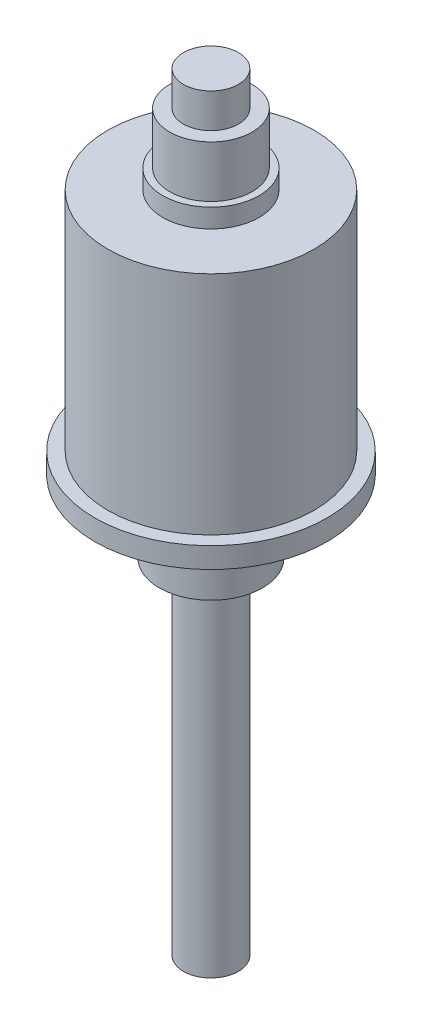
ISO-10303-21;
HEADER;
FILE_DESCRIPTION(('STEP AP214'),'2;1');
FILE_NAME('part.step','',(''),(''),'','','');
FILE_SCHEMA(('AUTOMOTIVE_DESIGN { 1 0 10303 214 1 1 1 1 }'));
ENDSEC;
DATA;
#1=APPLICATION_CONTEXT('core data for automotive mechanical design processes');
#2=APPLICATION_PROTOCOL_DEFINITION('international standard','automotive_design',2000,#1);
#3=PRODUCT_CONTEXT('',#1,'mechanical');
#4=PRODUCT('Part','Part','',(#3));
#5=PRODUCT_RELATED_PRODUCT_CATEGORY('part','',(#4));
#6=PRODUCT_DEFINITION_FORMATION('','',#4);
#7=PRODUCT_DEFINITION_CONTEXT('part definition',#1,'design');
#8=PRODUCT_DEFINITION('design','',#6,#7);
#9=PRODUCT_DEFINITION_SHAPE('','',#8);
#10=(LENGTH_UNIT() NAMED_UNIT(*) SI_UNIT(.MILLI.,.METRE.));
#11=(NAMED_UNIT(*) PLANE_ANGLE_UNIT() SI_UNIT($,.RADIAN.));
#12=(NAMED_UNIT(*) SI_UNIT($,.STERADIAN.) SOLID_ANGLE_UNIT());
#13=UNCERTAINTY_MEASURE_WITH_UNIT(LENGTH_MEASURE(1.E-05),#10,'distance_accuracy_value','');
#14=(GEOMETRIC_REPRESENTATION_CONTEXT(3) GLOBAL_UNCERTAINTY_ASSIGNED_CONTEXT((#13)) GLOBAL_UNIT_ASSIGNED_CONTEXT((#10,
#11,#12)) REPRESENTATION_CONTEXT('',''));
#15=CARTESIAN_POINT('',(0.,0.,0.));
#16=DIRECTION('',(0.,0.,1.));
#17=DIRECTION('',(1.,0.,0.));
#18=AXIS2_PLACEMENT_3D('',#15,#16,#17);
#19=CARTESIAN_POINT('',(0.,0.,0.));
#20=DIRECTION('',(0.,1.,0.));
#21=DIRECTION('',(0.,0.,1.));
#22=AXIS2_PLACEMENT_3D('',#19,#20,#21);
#23=PLANE('',#22);
#24=CARTESIAN_POINT('',(0.,0.,0.));
#25=DIRECTION('',(0.,1.,0.));
#26=DIRECTION('',(0.,0.,1.));
#27=AXIS2_PLACEMENT_3D('',#24,#25,#26);
#28=CIRCLE('',#27,4.);
#29=CARTESIAN_POINT('',(0.,0.,4.));
#30=VERTEX_POINT('',#29);
#31=EDGE_CURVE('E10',#30,#30,#28,.T.);
#32=ORIENTED_EDGE('',*,*,#31,.T.);
#33=EDGE_LOOP('',(#32));
#34=FACE_BOUND('',#33,.T.);
#35=ADVANCED_FACE('F37',(#34),#23,.T.);
#36=CARTESIAN_POINT('',(0.,40.0334496894889,0.));
#37=DIRECTION('',(0.,1.,0.));
#38=DIRECTION('',(0.,0.,1.));
#39=AXIS2_PLACEMENT_3D('',#36,#37,#38);
#40=CYLINDRICAL_SURFACE('',#39,4.);
#41=CARTESIAN_POINT('',(0.,-5.,0.));
#42=DIRECTION('',(0.,1.,0.));
#43=DIRECTION('',(0.,0.,1.));
#44=AXIS2_PLACEMENT_3D('',#41,#42,#43);
#45=CIRCLE('',#44,4.);
#46=CARTESIAN_POINT('',(0.,-5.,4.));
#47=VERTEX_POINT('',#46);
#48=EDGE_CURVE('E43',#47,#47,#45,.T.);
#49=ORIENTED_EDGE('',*,*,#48,.T.);
#50=EDGE_LOOP('',(#49));
#51=FACE_BOUND('',#50,.T.);
#52=ORIENTED_EDGE('',*,*,#31,.F.);
#53=EDGE_LOOP('',(#52));
#54=FACE_BOUND('',#53,.T.);
#55=ADVANCED_FACE('F105',(#51,#54),#40,.T.);
#56=CARTESIAN_POINT('',(-4.,-5.,0.));
#57=DIRECTION('',(0.,1.,0.));
#58=DIRECTION('',(0.,0.,1.));
#59=AXIS2_PLACEMENT_3D('',#56,#57,#58);
#60=PLANE('',#59);
#61=CARTESIAN_POINT('',(0.,-5.,0.));
#62=DIRECTION('',(0.,1.,0.));
#63=DIRECTION('',(0.,0.,1.));
#64=AXIS2_PLACEMENT_3D('',#61,#62,#63);
#65=CIRCLE('',#64,6.);
#66=CARTESIAN_POINT('',(0.,-5.,6.));
#67=VERTEX_POINT('',#66);
#68=EDGE_CURVE('E47',#67,#67,#65,.T.);
#69=ORIENTED_EDGE('',*,*,#68,.T.);
#70=EDGE_LOOP('',(#69));
#71=FACE_BOUND('',#70,.T.);
#72=ORIENTED_EDGE('',*,*,#48,.F.);
#73=EDGE_LOOP('',(#72));
#74=FACE_BOUND('',#73,.T.);
#75=ADVANCED_FACE('F109',(#71,#74),#60,.T.);
#76=CARTESIAN_POINT('',(0.,40.0334496894889,0.));
#77=DIRECTION('',(0.,1.,0.));
#78=DIRECTION('',(0.,0.,1.));
#79=AXIS2_PLACEMENT_3D('',#76,#77,#78);
#80=CYLINDRICAL_SURFACE('',#79,6.);
#81=CARTESIAN_POINT('',(0.,-12.5,0.));
#82=DIRECTION('',(0.,1.,0.));
#83=DIRECTION('',(0.,0.,1.));
#84=AXIS2_PLACEMENT_3D('',#81,#82,#83);
#85=CIRCLE('',#84,6.);
#86=CARTESIAN_POINT('',(0.,-12.5,6.));
#87=VERTEX_POINT('',#86);
#88=EDGE_CURVE('E51',#87,#87,#85,.T.);
#89=ORIENTED_EDGE('',*,*,#88,.T.);
#90=EDGE_LOOP('',(#89));
#91=FACE_BOUND('',#90,.T.);
#92=ORIENTED_EDGE('',*,*,#68,.F.);
#93=EDGE_LOOP('',(#92));
#94=FACE_BOUND('',#93,.T.);
#95=ADVANCED_FACE('F113',(#91,#94),#80,.T.);
#96=CARTESIAN_POINT('',(-6.,-12.5,0.));
#97=DIRECTION('',(0.,1.,0.));
#98=DIRECTION('',(0.,0.,1.));
#99=AXIS2_PLACEMENT_3D('',#96,#97,#98);
#100=PLANE('',#99);
#101=CARTESIAN_POINT('',(0.,-12.5,0.));
#102=DIRECTION('',(0.,1.,0.));
#103=DIRECTION('',(0.,0.,1.));
#104=AXIS2_PLACEMENT_3D('',#101,#102,#103);
#105=CIRCLE('',#104,7.);
#106=CARTESIAN_POINT('',(0.,-12.5,7.));
#107=VERTEX_POINT('',#106);
#108=EDGE_CURVE('E56',#107,#107,#105,.T.);
#109=ORIENTED_EDGE('',*,*,#108,.T.);
#110=EDGE_LOOP('',(#109));
#111=FACE_BOUND('',#110,.T.);
#112=ORIENTED_EDGE('',*,*,#88,.F.);
#113=EDGE_LOOP('',(#112));
#114=FACE_BOUND('',#113,.T.);
#115=ADVANCED_FACE('F120',(#111,#114),#100,.T.);
#116=CARTESIAN_POINT('',(0.,40.0334496894889,0.));
#117=DIRECTION('',(0.,1.,0.));
#118=DIRECTION('',(0.,0.,1.));
#119=AXIS2_PLACEMENT_3D('',#116,#117,#118);
#120=CYLINDRICAL_SURFACE('',#119,7.);
#121=CARTESIAN_POINT('',(0.,-15.25,0.));
#122=DIRECTION('',(0.,1.,0.));
#123=DIRECTION('',(0.,0.,1.));
#124=AXIS2_PLACEMENT_3D('',#121,#122,#123);
#125=CIRCLE('',#124,7.);
#126=CARTESIAN_POINT('',(0.,-15.25,7.));
#127=VERTEX_POINT('',#126);
#128=EDGE_CURVE('E59',#127,#127,#125,.T.);
#129=ORIENTED_EDGE('',*,*,#128,.T.);
#130=EDGE_LOOP('',(#129));
#131=FACE_BOUND('',#130,.T.);
#132=ORIENTED_EDGE('',*,*,#108,.F.);
#133=EDGE_LOOP('',(#132));
#134=FACE_BOUND('',#133,.T.);
#135=ADVANCED_FACE('F124',(#131,#134),#120,.T.);
#136=CARTESIAN_POINT('',(-7.,-15.25,0.));
#137=DIRECTION('',(0.,1.,0.));
#138=DIRECTION('',(0.,0.,1.));
#139=AXIS2_PLACEMENT_3D('',#136,#137,#138);
#140=PLANE('',#139);
#141=CARTESIAN_POINT('',(0.,-15.25,0.));
#142=DIRECTION('',(0.,1.,0.));
#143=DIRECTION('',(0.,0.,1.));
#144=AXIS2_PLACEMENT_3D('',#141,#142,#143);
#145=CIRCLE('',#144,14.9815);
#146=CARTESIAN_POINT('',(0.,-15.25,14.9815));
#147=VERTEX_POINT('',#146);
#148=EDGE_CURVE('E62',#147,#147,#145,.T.);
#149=ORIENTED_EDGE('',*,*,#148,.T.);
#150=EDGE_LOOP('',(#149));
#151=FACE_BOUND('',#150,.T.);
#152=ORIENTED_EDGE('',*,*,#128,.F.);
#153=EDGE_LOOP('',(#152));
#154=FACE_BOUND('',#153,.T.);
#155=ADVANCED_FACE('F128',(#151,#154),#140,.T.);
#156=CARTESIAN_POINT('',(0.,40.0334496894889,0.));
#157=DIRECTION('',(0.,1.,0.));
#158=DIRECTION('',(0.,0.,1.));
#159=AXIS2_PLACEMENT_3D('',#156,#157,#158);
#160=CYLINDRICAL_SURFACE('',#159,14.9815);
#161=CARTESIAN_POINT('',(0.,-48.11,0.));
#162=DIRECTION('',(0.,1.,0.));
#163=DIRECTION('',(0.,0.,1.));
#164=AXIS2_PLACEMENT_3D('',#161,#162,#163);
#165=CIRCLE('',#164,14.9815);
#166=CARTESIAN_POINT('',(0.,-48.11,14.9815));
#167=VERTEX_POINT('',#166);
#168=EDGE_CURVE('E65',#167,#167,#165,.T.);
#169=ORIENTED_EDGE('',*,*,#168,.T.);
#170=EDGE_LOOP('',(#169));
#171=FACE_BOUND('',#170,.T.);
#172=ORIENTED_EDGE('',*,*,#148,.F.);
#173=EDGE_LOOP('',(#172));
#174=FACE_BOUND('',#173,.T.);
#175=ADVANCED_FACE('F132',(#171,#174),#160,.T.);
#176=CARTESIAN_POINT('',(-16.8815,-48.11,0.));
#177=DIRECTION('',(0.,1.,0.));
#178=DIRECTION('',(0.,0.,1.));
#179=AXIS2_PLACEMENT_3D('',#176,#177,#178);
#180=PLANE('',#179);
#181=CARTESIAN_POINT('',(0.,-48.11,0.));
#182=DIRECTION('',(0.,1.,0.));
#183=DIRECTION('',(0.,0.,1.));
#184=AXIS2_PLACEMENT_3D('',#181,#182,#183);
#185=CIRCLE('',#184,16.8815);
#186=CARTESIAN_POINT('',(0.,-48.11,16.8815));
#187=VERTEX_POINT('',#186);
#188=EDGE_CURVE('E68',#187,#187,#185,.T.);
#189=ORIENTED_EDGE('',*,*,#188,.T.);
#190=EDGE_LOOP('',(#189));
#191=FACE_BOUND('',#190,.T.);
#192=ORIENTED_EDGE('',*,*,#168,.F.);
#193=EDGE_LOOP('',(#192));
#194=FACE_BOUND('',#193,.T.);
#195=ADVANCED_FACE('F136',(#191,#194),#180,.T.);
#196=CARTESIAN_POINT('',(0.,40.0334496894889,0.));
#197=DIRECTION('',(0.,1.,0.));
#198=DIRECTION('',(0.,0.,1.));
#199=AXIS2_PLACEMENT_3D('',#196,#197,#198);
#200=CYLINDRICAL_SURFACE('',#199,16.8815);
#201=CARTESIAN_POINT('',(0.,-51.11,0.));
#202=DIRECTION('',(0.,1.,0.));
#203=DIRECTION('',(0.,0.,1.));
#204=AXIS2_PLACEMENT_3D('',#201,#202,#203);
#205=CIRCLE('',#204,16.8815);
#206=CARTESIAN_POINT('',(0.,-51.11,16.8815));
#207=VERTEX_POINT('',#206);
#208=EDGE_CURVE('E71',#207,#207,#205,.T.);
#209=ORIENTED_EDGE('',*,*,#208,.T.);
#210=EDGE_LOOP('',(#209));
#211=FACE_BOUND('',#210,.T.);
#212=ORIENTED_EDGE('',*,*,#188,.F.);
#213=EDGE_LOOP('',(#212));
#214=FACE_BOUND('',#213,.T.);
#215=ADVANCED_FACE('F140',(#211,#214),#200,.T.);
#216=CARTESIAN_POINT('',(-16.8815,-51.11,0.));
#217=DIRECTION('',(0.,-1.,0.));
#218=DIRECTION('',(0.,0.,-1.));
#219=AXIS2_PLACEMENT_3D('',#216,#217,#218);
#220=PLANE('',#219);
#221=CARTESIAN_POINT('',(0.,-51.11,0.));
#222=DIRECTION('',(0.,1.,0.));
#223=DIRECTION('',(0.,0.,1.));
#224=AXIS2_PLACEMENT_3D('',#221,#222,#223);
#225=CIRCLE('',#224,9.);
#226=CARTESIAN_POINT('',(0.,-51.11,9.));
#227=VERTEX_POINT('',#226);
#228=EDGE_CURVE('E74',#227,#227,#225,.T.);
#229=ORIENTED_EDGE('',*,*,#228,.T.);
#230=EDGE_LOOP('',(#229));
#231=FACE_BOUND('',#230,.T.);
#232=ORIENTED_EDGE('',*,*,#208,.F.);
#233=EDGE_LOOP('',(#232));
#234=FACE_BOUND('',#233,.T.);
#235=ADVANCED_FACE('F144',(#231,#234),#220,.T.);
#236=CARTESIAN_POINT('',(0.,40.0334496894889,0.));
#237=DIRECTION('',(0.,1.,0.));
#238=DIRECTION('',(0.,0.,1.));
#239=AXIS2_PLACEMENT_3D('',#236,#237,#238);
#240=CYLINDRICAL_SURFACE('',#239,9.);
#241=CARTESIAN_POINT('',(0.,-53.61,0.));
#242=DIRECTION('',(0.,1.,0.));
#243=DIRECTION('',(0.,0.,1.));
#244=AXIS2_PLACEMENT_3D('',#241,#242,#243);
#245=CIRCLE('',#244,9.);
#246=CARTESIAN_POINT('',(0.,-53.61,9.));
#247=VERTEX_POINT('',#246);
#248=EDGE_CURVE('E77',#247,#247,#245,.T.);
#249=ORIENTED_EDGE('',*,*,#248,.T.);
#250=EDGE_LOOP('',(#249));
#251=FACE_BOUND('',#250,.T.);
#252=ORIENTED_EDGE('',*,*,#228,.F.);
#253=EDGE_LOOP('',(#252));
#254=FACE_BOUND('',#253,.T.);
#255=ADVANCED_FACE('F148',(#251,#254),#240,.T.);
#256=CARTESIAN_POINT('',(-9.,-53.61,0.));
#257=DIRECTION('',(0.,-1.,0.));
#258=DIRECTION('',(0.,0.,-1.));
#259=AXIS2_PLACEMENT_3D('',#256,#257,#258);
#260=PLANE('',#259);
#261=CARTESIAN_POINT('',(0.,-53.61,0.));
#262=DIRECTION('',(0.,1.,0.));
#263=DIRECTION('',(0.,0.,1.));
#264=AXIS2_PLACEMENT_3D('',#261,#262,#263);
#265=CIRCLE('',#264,7.5);
#266=CARTESIAN_POINT('',(0.,-53.61,7.5));
#267=VERTEX_POINT('',#266);
#268=EDGE_CURVE('E80',#267,#267,#265,.T.);
#269=ORIENTED_EDGE('',*,*,#268,.T.);
#270=EDGE_LOOP('',(#269));
#271=FACE_BOUND('',#270,.T.);
#272=ORIENTED_EDGE('',*,*,#248,.F.);
#273=EDGE_LOOP('',(#272));
#274=FACE_BOUND('',#273,.T.);
#275=ADVANCED_FACE('F152',(#271,#274),#260,.T.);
#276=CARTESIAN_POINT('',(0.,40.0334496894889,0.));
#277=DIRECTION('',(0.,1.,0.));
#278=DIRECTION('',(0.,0.,1.));
#279=AXIS2_PLACEMENT_3D('',#276,#277,#278);
#280=CYLINDRICAL_SURFACE('',#279,7.5);
#281=CARTESIAN_POINT('',(0.,-61.61,0.));
#282=DIRECTION('',(0.,1.,0.));
#283=DIRECTION('',(0.,0.,1.));
#284=AXIS2_PLACEMENT_3D('',#281,#282,#283);
#285=CIRCLE('',#284,7.5);
#286=CARTESIAN_POINT('',(0.,-61.61,7.5));
#287=VERTEX_POINT('',#286);
#288=EDGE_CURVE('E83',#287,#287,#285,.T.);
#289=ORIENTED_EDGE('',*,*,#288,.T.);
#290=EDGE_LOOP('',(#289));
#291=FACE_BOUND('',#290,.T.);
#292=ORIENTED_EDGE('',*,*,#268,.F.);
#293=EDGE_LOOP('',(#292));
#294=FACE_BOUND('',#293,.T.);
#295=ADVANCED_FACE('F156',(#291,#294),#280,.T.);
#296=CARTESIAN_POINT('',(-7.5,-61.61,0.));
#297=DIRECTION('',(0.,-1.,0.));
#298=DIRECTION('',(0.,0.,-1.));
#299=AXIS2_PLACEMENT_3D('',#296,#297,#298);
#300=PLANE('',#299);
#301=CARTESIAN_POINT('',(0.,-61.61,0.));
#302=DIRECTION('',(0.,1.,0.));
#303=DIRECTION('',(0.,0.,1.));
#304=AXIS2_PLACEMENT_3D('',#301,#302,#303);
#305=CIRCLE('',#304,4.);
#306=CARTESIAN_POINT('',(0.,-61.61,4.));
#307=VERTEX_POINT('',#306);
#308=EDGE_CURVE('E86',#307,#307,#305,.T.);
#309=ORIENTED_EDGE('',*,*,#308,.T.);
#310=EDGE_LOOP('',(#309));
#311=FACE_BOUND('',#310,.T.);
#312=ORIENTED_EDGE('',*,*,#288,.F.);
#313=EDGE_LOOP('',(#312));
#314=FACE_BOUND('',#313,.T.);
#315=ADVANCED_FACE('F102',(#311,#314),#300,.T.);
#316=CARTESIAN_POINT('',(0.,40.0334496894889,0.));
#317=DIRECTION('',(0.,1.,0.));
#318=DIRECTION('',(0.,0.,1.));
#319=AXIS2_PLACEMENT_3D('',#316,#317,#318);
#320=CYLINDRICAL_SURFACE('',#319,3.99999999999999);
#321=CARTESIAN_POINT('',(0.,-111.61,0.));
#322=DIRECTION('',(0.,1.,0.));
#323=DIRECTION('',(0.,0.,1.));
#324=AXIS2_PLACEMENT_3D('',#321,#322,#323);
#325=CIRCLE('',#324,3.99999999999999);
#326=CARTESIAN_POINT('',(0.,-111.61,3.99999999999999));
#327=VERTEX_POINT('',#326);
#328=EDGE_CURVE('E89',#327,#327,#325,.T.);
#329=ORIENTED_EDGE('',*,*,#328,.T.);
#330=EDGE_LOOP('',(#329));
#331=FACE_BOUND('',#330,.T.);
#332=ORIENTED_EDGE('',*,*,#308,.F.);
#333=EDGE_LOOP('',(#332));
#334=FACE_BOUND('',#333,.T.);
#335=ADVANCED_FACE('F93',(#331,#334),#320,.T.);
#336=CARTESIAN_POINT('',(-3.99999999999999,-111.61,0.));
#337=DIRECTION('',(0.,-1.,0.));
#338=DIRECTION('',(0.,0.,-1.));
#339=AXIS2_PLACEMENT_3D('',#336,#337,#338);
#340=PLANE('',#339);
#341=ORIENTED_EDGE('',*,*,#328,.F.);
#342=EDGE_LOOP('',(#341));
#343=FACE_BOUND('',#342,.T.);
#344=ADVANCED_FACE('F96',(#343),#340,.T.);
#345=CLOSED_SHELL('',(#35,#55,#75,#95,#115,#135,#155,#175,#195,#215,#235,#255,#275,#295,#315,
#335,#344));
#346=MANIFOLD_SOLID_BREP('B2',#345);
#347=ADVANCED_BREP_SHAPE_REPRESENTATION('',(#18,#346),#14);
#348=SHAPE_DEFINITION_REPRESENTATION(#9,#347);
ENDSEC;
END-ISO-10303-21;
